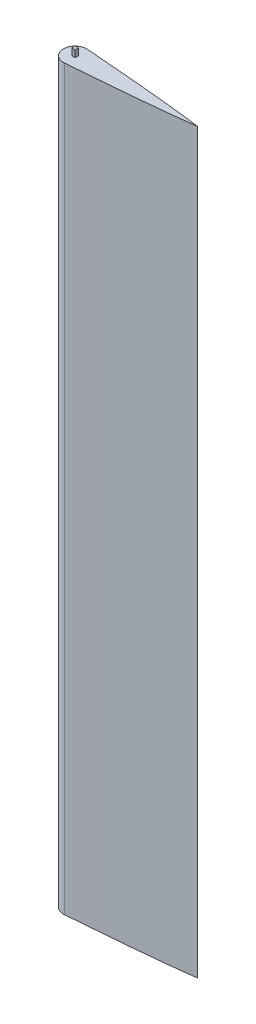
ISO-10303-21;
HEADER;
FILE_DESCRIPTION(('STEP AP214'),'2;1');
FILE_NAME('part.step','',(''),(''),'','','');
FILE_SCHEMA(('AUTOMOTIVE_DESIGN { 1 0 10303 214 1 1 1 1 }'));
ENDSEC;
DATA;
#1=APPLICATION_CONTEXT('core data for automotive mechanical design processes');
#2=APPLICATION_PROTOCOL_DEFINITION('international standard','automotive_design',2000,#1);
#3=PRODUCT_CONTEXT('',#1,'mechanical');
#4=PRODUCT('Part','Part','',(#3));
#5=PRODUCT_RELATED_PRODUCT_CATEGORY('part','',(#4));
#6=PRODUCT_DEFINITION_FORMATION('','',#4);
#7=PRODUCT_DEFINITION_CONTEXT('part definition',#1,'design');
#8=PRODUCT_DEFINITION('design','',#6,#7);
#9=PRODUCT_DEFINITION_SHAPE('','',#8);
#10=(LENGTH_UNIT() NAMED_UNIT(*) SI_UNIT(.MILLI.,.METRE.));
#11=(NAMED_UNIT(*) PLANE_ANGLE_UNIT() SI_UNIT($,.RADIAN.));
#12=(NAMED_UNIT(*) SI_UNIT($,.STERADIAN.) SOLID_ANGLE_UNIT());
#13=UNCERTAINTY_MEASURE_WITH_UNIT(LENGTH_MEASURE(1.E-05),#10,'distance_accuracy_value','');
#14=(GEOMETRIC_REPRESENTATION_CONTEXT(3) GLOBAL_UNCERTAINTY_ASSIGNED_CONTEXT((#13)) GLOBAL_UNIT_ASSIGNED_CONTEXT((#10,
#11,#12)) REPRESENTATION_CONTEXT('',''));
#15=CARTESIAN_POINT('',(0.,0.,0.));
#16=DIRECTION('',(0.,0.,1.));
#17=DIRECTION('',(1.,0.,0.));
#18=AXIS2_PLACEMENT_3D('',#15,#16,#17);
#19=CARTESIAN_POINT('',(1000.,220.,0.));
#20=CARTESIAN_POINT('',(1000.00413613689,220.,-0.0513414966727191));
#21=CARTESIAN_POINT('',(1000.01817994757,220.,-0.225666060429818));
#22=CARTESIAN_POINT('',(1000.16884232111,220.,-0.540340060592524));
#23=CARTESIAN_POINT('',(1000.4745357247,220.,-0.950597665115014));
#24=CARTESIAN_POINT('',(1001.00360978021,220.,-1.44445832491377));
#25=CARTESIAN_POINT('',(1001.88069119015,220.,-2.02908702601063));
#26=CARTESIAN_POINT('',(1003.27369514241,220.,-2.64181194471628));
#27=CARTESIAN_POINT('',(1005.18752958675,220.,-3.2143505546475));
#28=CARTESIAN_POINT('',(1007.49056329049,220.,-3.72188328287637));
#29=CARTESIAN_POINT('',(1009.9978475025,220.,-4.16061643478134));
#30=CARTESIAN_POINT('',(1012.58979683905,220.,-4.5274491318209));
#31=CARTESIAN_POINT('',(1015.22215521288,220.,-4.82640929712996));
#32=CARTESIAN_POINT('',(1017.8798758622,220.,-5.0656463590458));
#33=CARTESIAN_POINT('',(1020.55728748289,220.,-5.25773571248717));
#34=CARTESIAN_POINT('',(1023.24913184173,220.,-5.40664331406146));
#35=CARTESIAN_POINT('',(1025.95111776376,220.,-5.52117781773406));
#36=CARTESIAN_POINT('',(1028.6616767227,220.,-5.60212082629922));
#37=CARTESIAN_POINT('',(1031.37745516181,220.,-5.65541034888753));
#38=CARTESIAN_POINT('',(1034.09779748937,220.,-5.68359849417077));
#39=CARTESIAN_POINT('',(1036.82178898012,220.,-5.68551314895913));
#40=CARTESIAN_POINT('',(1039.54985059279,220.,-5.66680050341008));
#41=CARTESIAN_POINT('',(1043.19336684222,220.,-5.61631334010591));
#42=CARTESIAN_POINT('',(1046.83942417105,220.,-5.53046941537065));
#43=CARTESIAN_POINT('',(1050.4876552261,220.,-5.41471957955391));
#44=CARTESIAN_POINT('',(1053.22648580868,220.,-5.3143162649764));
#45=CARTESIAN_POINT('',(1056.88031871196,220.,-5.16385140479881));
#46=CARTESIAN_POINT('',(1060.53469143182,220.,-4.98973605616077));
#47=CARTESIAN_POINT('',(1064.18949961503,220.,-4.79465845283444));
#48=CARTESIAN_POINT('',(1066.93177674791,220.,-4.63856062331077));
#49=CARTESIAN_POINT('',(1070.58915829291,220.,-4.41830608921612));
#50=CARTESIAN_POINT('',(1074.24643545999,220.,-4.18091191600088));
#51=CARTESIAN_POINT('',(1078.81840685728,220.,-3.86430582644972));
#52=CARTESIAN_POINT('',(1082.47615124474,220.,-3.59601785291006));
#53=CARTESIAN_POINT('',(1086.13339366041,220.,-3.31439385666073));
#54=CARTESIAN_POINT('',(1088.8759632214,220.,-3.09637478585474));
#55=CARTESIAN_POINT('',(1091.61799893897,220.,-2.8714046664782));
#56=CARTESIAN_POINT('',(1094.35968365379,220.,-2.63961817275009));
#57=CARTESIAN_POINT('',(1097.10106065168,220.,-2.40120118659106));
#58=CARTESIAN_POINT('',(1099.84175214664,220.,-2.15631577874861));
#59=CARTESIAN_POINT('',(1102.58081364936,220.,-1.90455090633259));
#60=CARTESIAN_POINT('',(1105.31707001157,220.,-1.64547853591484));
#61=CARTESIAN_POINT('',(1108.04948150949,220.,-1.37722038964263));
#62=CARTESIAN_POINT('',(1110.77648744449,220.,-1.0976386329448));
#63=CARTESIAN_POINT('',(1113.48794761282,220.,-0.807843629365417));
#64=CARTESIAN_POINT('',(1116.12783503238,220.,-0.505124450753502));
#65=CARTESIAN_POINT('',(1118.29491033691,220.,-0.236043522796747));
#66=CARTESIAN_POINT('',(1119.56565292166,220.,-0.060128693936704));
#67=CARTESIAN_POINT('',(1120.,220.,0.));
#68=B_SPLINE_CURVE_WITH_KNOTS('',3,(#19,#20,#21,#22,#23,#24,#25,#26,#27,#28,#29,#30,#31,#32,#33,
#34,#35,#36,#37,#38,#39,#40,#41,#42,#43,#44,#45,#46,#47,#48,#49,#50,#51,#52,#53,#54,#55,#56,#57,
#58,#59,#60,#61,#62,#63,#64,#65,#66,#67),.UNSPECIFIED.,.F.,.F.,(4,1,1,1,1,1,1,1,1,1,1,1,1,1,1,1,
1,1,1,1,1,1,1,1,1,1,1,1,1,1,1,1,1,1,1,1,1,1,1,1,1,1,1,1,1,1,4),(0.,0.00126617665151783,
0.00429916747114532,0.00839844934062874,0.0138887071570412,0.0220514195977793,
0.0343025286004704,0.0512809792222127,0.0712839615209467,0.092471998761859,0.114085613956521,
0.135878251482366,0.15784644888147,0.179935950117866,0.202120581100522,0.224377529096981,
0.246676263269634,0.269042626432452,0.29141201691861,0.313813994985901,0.336267016548707,
0.358738731103596,0.403740067464737,0.426271069557772,0.448818121995205,0.471376668600461,
0.516519940420265,0.539105680915336,0.561701662410306,0.584305866492303,0.62952936536456,
0.652148901694669,0.697407359758077,0.720040805867352,0.742672894666943,0.765304529885395,
0.787938654860651,0.81057607841219,0.833214133227245,0.855845421097598,0.878458096210862,
0.901043957953586,0.92360245187902,0.946110353688878,0.968340531725538,0.989178612795693,1.),.UNSPECIFIED.);
#69=DIRECTION('',(0.,-1.,0.));
#70=VECTOR('',#69,1.);
#71=SURFACE_OF_LINEAR_EXTRUSION('',#68,#70);
#72=CARTESIAN_POINT('',(1000.,0.,0.));
#73=CARTESIAN_POINT('',(1000.00413613689,0.,-0.0513414966727191));
#74=CARTESIAN_POINT('',(1000.01817994757,0.,-0.225666060429818));
#75=CARTESIAN_POINT('',(1000.16884232111,0.,-0.540340060592524));
#76=CARTESIAN_POINT('',(1000.4745357247,0.,-0.950597665115014));
#77=CARTESIAN_POINT('',(1001.00360978021,0.,-1.44445832491377));
#78=CARTESIAN_POINT('',(1001.88069119015,0.,-2.02908702601063));
#79=CARTESIAN_POINT('',(1003.27369514241,0.,-2.64181194471628));
#80=CARTESIAN_POINT('',(1005.18752958675,0.,-3.2143505546475));
#81=CARTESIAN_POINT('',(1007.49056329049,0.,-3.72188328287637));
#82=CARTESIAN_POINT('',(1009.9978475025,0.,-4.16061643478134));
#83=CARTESIAN_POINT('',(1012.58979683905,0.,-4.5274491318209));
#84=CARTESIAN_POINT('',(1015.22215521288,0.,-4.82640929712996));
#85=CARTESIAN_POINT('',(1017.8798758622,0.,-5.0656463590458));
#86=CARTESIAN_POINT('',(1020.55728748289,0.,-5.25773571248717));
#87=CARTESIAN_POINT('',(1023.24913184173,0.,-5.40664331406146));
#88=CARTESIAN_POINT('',(1025.95111776376,0.,-5.52117781773406));
#89=CARTESIAN_POINT('',(1028.6616767227,0.,-5.60212082629922));
#90=CARTESIAN_POINT('',(1031.37745516181,0.,-5.65541034888753));
#91=CARTESIAN_POINT('',(1034.09779748937,0.,-5.68359849417077));
#92=CARTESIAN_POINT('',(1036.82178898012,0.,-5.68551314895913));
#93=CARTESIAN_POINT('',(1039.54985059279,0.,-5.66680050341008));
#94=CARTESIAN_POINT('',(1043.19336684222,0.,-5.61631334010591));
#95=CARTESIAN_POINT('',(1046.83942417105,0.,-5.53046941537065));
#96=CARTESIAN_POINT('',(1050.4876552261,0.,-5.41471957955391));
#97=CARTESIAN_POINT('',(1053.22648580868,0.,-5.3143162649764));
#98=CARTESIAN_POINT('',(1056.88031871196,0.,-5.16385140479881));
#99=CARTESIAN_POINT('',(1060.53469143182,0.,-4.98973605616077));
#100=CARTESIAN_POINT('',(1064.18949961503,0.,-4.79465845283444));
#101=CARTESIAN_POINT('',(1066.93177674791,0.,-4.63856062331077));
#102=CARTESIAN_POINT('',(1070.58915829291,0.,-4.41830608921612));
#103=CARTESIAN_POINT('',(1074.24643545999,0.,-4.18091191600088));
#104=CARTESIAN_POINT('',(1078.81840685728,0.,-3.86430582644972));
#105=CARTESIAN_POINT('',(1082.47615124474,0.,-3.59601785291006));
#106=CARTESIAN_POINT('',(1086.13339366041,0.,-3.31439385666073));
#107=CARTESIAN_POINT('',(1088.8759632214,0.,-3.09637478585474));
#108=CARTESIAN_POINT('',(1091.61799893897,0.,-2.8714046664782));
#109=CARTESIAN_POINT('',(1094.35968365379,0.,-2.63961817275009));
#110=CARTESIAN_POINT('',(1097.10106065168,0.,-2.40120118659106));
#111=CARTESIAN_POINT('',(1099.84175214664,0.,-2.15631577874861));
#112=CARTESIAN_POINT('',(1102.58081364936,0.,-1.90455090633259));
#113=CARTESIAN_POINT('',(1105.31707001157,0.,-1.64547853591484));
#114=CARTESIAN_POINT('',(1108.04948150949,0.,-1.37722038964263));
#115=CARTESIAN_POINT('',(1110.77648744449,0.,-1.0976386329448));
#116=CARTESIAN_POINT('',(1113.48794761282,0.,-0.807843629365417));
#117=CARTESIAN_POINT('',(1116.12783503238,0.,-0.505124450753502));
#118=CARTESIAN_POINT('',(1118.29491033691,0.,-0.236043522796747));
#119=CARTESIAN_POINT('',(1119.56565292166,0.,-0.060128693936704));
#120=CARTESIAN_POINT('',(1120.,0.,0.));
#121=B_SPLINE_CURVE_WITH_KNOTS('',3,(#72,#73,#74,#75,#76,#77,#78,#79,#80,#81,#82,#83,#84,#85,
#86,#87,#88,#89,#90,#91,#92,#93,#94,#95,#96,#97,#98,#99,#100,#101,#102,#103,#104,#105,#106,#107,
#108,#109,#110,#111,#112,#113,#114,#115,#116,#117,#118,#119,#120),.UNSPECIFIED.,.F.,.F.,(4,1,1,
1,1,1,1,1,1,1,1,1,1,1,1,1,1,1,1,1,1,1,1,1,1,1,1,1,1,1,1,1,1,1,1,1,1,1,1,1,1,1,1,1,1,1,4),(0.,
0.00126617665151783,0.00429916747114532,0.00839844934062874,0.0138887071570412,
0.0220514195977793,0.0343025286004704,0.0512809792222127,0.0712839615209467,0.092471998761859,
0.114085613956521,0.135878251482366,0.15784644888147,0.179935950117866,0.202120581100522,
0.224377529096981,0.246676263269634,0.269042626432452,0.29141201691861,0.313813994985901,
0.336267016548707,0.358738731103596,0.403740067464737,0.426271069557772,0.448818121995205,
0.471376668600461,0.516519940420265,0.539105680915336,0.561701662410306,0.584305866492303,
0.62952936536456,0.652148901694669,0.697407359758077,0.720040805867352,0.742672894666943,
0.765304529885395,0.787938654860651,0.81057607841219,0.833214133227245,0.855845421097598,
0.878458096210862,0.901043957953586,0.92360245187902,0.946110353688878,0.968340531725538,
0.989178612795693,1.),.UNSPECIFIED.);
#122=CARTESIAN_POINT('',(1083.7717477888,0.,-3.49553665701031));
#123=VERTEX_POINT('',#122);
#124=CARTESIAN_POINT('',(1120.,0.,0.));
#125=VERTEX_POINT('',#124);
#126=EDGE_CURVE('E151',#123,#125,#121,.T.);
#127=ORIENTED_EDGE('',*,*,#126,.F.);
#128=DIRECTION('',(0.,-1.,0.));
#129=VECTOR('',#128,1.);
#130=CARTESIAN_POINT('',(1083.7717477888,220.,-3.49553665701031));
#131=LINE('',#130,#129);
#132=CARTESIAN_POINT('',(1083.7717477888,220.,-3.49553665701031));
#133=VERTEX_POINT('',#132);
#134=EDGE_CURVE('E11',#133,#123,#131,.T.);
#135=ORIENTED_EDGE('',*,*,#134,.F.);
#136=CARTESIAN_POINT('',(1120.,220.,0.));
#137=VERTEX_POINT('',#136);
#138=EDGE_CURVE('E159',#133,#137,#68,.T.);
#139=ORIENTED_EDGE('',*,*,#138,.T.);
#140=DIRECTION('',(0.,-1.,0.));
#141=VECTOR('',#140,1.);
#142=CARTESIAN_POINT('',(1120.,220.,0.));
#143=LINE('',#142,#141);
#144=EDGE_CURVE('E215',#137,#125,#143,.T.);
#145=ORIENTED_EDGE('',*,*,#144,.T.);
#146=EDGE_LOOP('',(#127,#135,#139,#145));
#147=FACE_BOUND('',#146,.T.);
#148=ADVANCED_FACE('F37',(#147),#71,.T.);
#149=CARTESIAN_POINT('',(1083.50565040565,220.,6.13392382947751E-08));
#150=DIRECTION('',(0.,-1.,0.));
#151=DIRECTION('',(0.,0.,-1.));
#152=AXIS2_PLACEMENT_3D('',#149,#150,#151);
#153=CYLINDRICAL_SURFACE('',#152,3.50565040565225);
#154=CARTESIAN_POINT('',(1083.50565040565,0.,6.13392382947751E-08));
#155=DIRECTION('',(0.,1.,0.));
#156=DIRECTION('',(0.,0.,1.));
#157=AXIS2_PLACEMENT_3D('',#154,#155,#156);
#158=CIRCLE('',#157,3.50565040565225);
#159=CARTESIAN_POINT('',(1083.7717441902,0.,3.49553705362999));
#160=VERTEX_POINT('',#159);
#161=EDGE_CURVE('E155',#123,#160,#158,.T.);
#162=ORIENTED_EDGE('',*,*,#161,.T.);
#163=DIRECTION('',(0.,-1.,0.));
#164=VECTOR('',#163,1.);
#165=CARTESIAN_POINT('',(1083.7717441902,220.,3.49553705362999));
#166=LINE('',#165,#164);
#167=CARTESIAN_POINT('',(1083.7717441902,220.,3.49553705362999));
#168=VERTEX_POINT('',#167);
#169=EDGE_CURVE('E46',#168,#160,#166,.T.);
#170=ORIENTED_EDGE('',*,*,#169,.F.);
#171=CARTESIAN_POINT('',(1083.50565040565,220.,6.13392382947751E-08));
#172=DIRECTION('',(0.,1.,0.));
#173=DIRECTION('',(0.,0.,1.));
#174=AXIS2_PLACEMENT_3D('',#171,#172,#173);
#175=CIRCLE('',#174,3.50565040565225);
#176=EDGE_CURVE('E164',#133,#168,#175,.T.);
#177=ORIENTED_EDGE('',*,*,#176,.F.);
#178=ORIENTED_EDGE('',*,*,#134,.T.);
#179=EDGE_LOOP('',(#162,#170,#177,#178));
#180=FACE_BOUND('',#179,.T.);
#181=ADVANCED_FACE('F186',(#180),#153,.T.);
#182=CARTESIAN_POINT('',(1120.,220.,0.));
#183=CARTESIAN_POINT('',(1119.56565292166,220.,0.060128693936704));
#184=CARTESIAN_POINT('',(1118.29491033691,220.,0.236043522796747));
#185=CARTESIAN_POINT('',(1116.12783503238,220.,0.505124450753503));
#186=CARTESIAN_POINT('',(1113.48794761283,220.,0.807843629365417));
#187=CARTESIAN_POINT('',(1110.77648744449,220.,1.0976386329448));
#188=CARTESIAN_POINT('',(1108.04948150949,220.,1.37722038964263));
#189=CARTESIAN_POINT('',(1105.31707001157,220.,1.64547853591484));
#190=CARTESIAN_POINT('',(1102.58081364936,220.,1.90455090633259));
#191=CARTESIAN_POINT('',(1099.84175214664,220.,2.15631577874861));
#192=CARTESIAN_POINT('',(1097.10106065169,220.,2.40120118659106));
#193=CARTESIAN_POINT('',(1094.35968365379,220.,2.63961817275009));
#194=CARTESIAN_POINT('',(1091.61799893897,220.,2.8714046664782));
#195=CARTESIAN_POINT('',(1087.96191780518,220.,3.17136757500199));
#196=CARTESIAN_POINT('',(1083.3907575757,220.,3.52893034218228));
#197=CARTESIAN_POINT('',(1078.81840685728,220.,3.86430582644971));
#198=CARTESIAN_POINT('',(1074.24643545999,220.,4.18091191600089));
#199=CARTESIAN_POINT('',(1070.58915829291,220.,4.41830608921612));
#200=CARTESIAN_POINT('',(1066.93177674791,220.,4.63856062331077));
#201=CARTESIAN_POINT('',(1064.18949961503,220.,4.79465845283444));
#202=CARTESIAN_POINT('',(1060.53469143182,220.,4.98973605616077));
#203=CARTESIAN_POINT('',(1056.88031871196,220.,5.16385140479881));
#204=CARTESIAN_POINT('',(1053.22648580868,220.,5.3143162649764));
#205=CARTESIAN_POINT('',(1050.4876552261,220.,5.41471957955391));
#206=CARTESIAN_POINT('',(1046.83942417105,220.,5.53046941537065));
#207=CARTESIAN_POINT('',(1043.19336684222,220.,5.61631334010591));
#208=CARTESIAN_POINT('',(1039.54985059279,220.,5.66680050341008));
#209=CARTESIAN_POINT('',(1036.82178898012,220.,5.68551314895913));
#210=CARTESIAN_POINT('',(1034.09779748937,220.,5.68359849417077));
#211=CARTESIAN_POINT('',(1031.37745516181,220.,5.65541034888753));
#212=CARTESIAN_POINT('',(1028.6616767227,220.,5.60212082629922));
#213=CARTESIAN_POINT('',(1025.95111776376,220.,5.52117781773406));
#214=CARTESIAN_POINT('',(1023.24913184173,220.,5.40664331406146));
#215=CARTESIAN_POINT('',(1020.55728748289,220.,5.25773571248717));
#216=CARTESIAN_POINT('',(1017.8798758622,220.,5.0656463590458));
#217=CARTESIAN_POINT('',(1015.22215521288,220.,4.82640929712996));
#218=CARTESIAN_POINT('',(1012.58979683905,220.,4.5274491318209));
#219=CARTESIAN_POINT('',(1009.9978475025,220.,4.16061643478134));
#220=CARTESIAN_POINT('',(1007.49056329049,220.,3.72188328287637));
#221=CARTESIAN_POINT('',(1005.18752958675,220.,3.2143505546475));
#222=CARTESIAN_POINT('',(1003.27369514241,220.,2.64181194471628));
#223=CARTESIAN_POINT('',(1001.88069119015,220.,2.02908702601063));
#224=CARTESIAN_POINT('',(1001.00360978021,220.,1.44445832491377));
#225=CARTESIAN_POINT('',(1000.4745357247,220.,0.950597665115007));
#226=CARTESIAN_POINT('',(1000.16884232111,220.,0.540340060592529));
#227=CARTESIAN_POINT('',(1000.01817994757,220.,0.225666060429815));
#228=CARTESIAN_POINT('',(1000.00413613689,220.,0.051341496672719));
#229=CARTESIAN_POINT('',(1000.,220.,0.));
#230=B_SPLINE_CURVE_WITH_KNOTS('',3,(#182,#183,#184,#185,#186,#187,#188,#189,#190,#191,#192,
#193,#194,#195,#196,#197,#198,#199,#200,#201,#202,#203,#204,#205,#206,#207,#208,#209,#210,#211,
#212,#213,#214,#215,#216,#217,#218,#219,#220,#221,#222,#223,#224,#225,#226,#227,#228,#229),
.UNSPECIFIED.,.F.,.F.,(4,1,1,1,1,1,1,1,1,1,1,1,1,1,1,1,1,1,1,1,1,1,1,1,1,1,1,1,1,1,1,1,1,1,1,1,
1,1,1,1,1,1,1,1,1,4),(0.,0.010821387204307,0.0316594682744622,0.0538896463111219,
0.0763975481209804,0.0989560420464143,0.121541903789138,0.144154578902402,0.166785866772755,
0.18942392158781,0.212061345139349,0.234695470114605,0.257327105333057,0.302592640241923,
0.347851098305331,0.37047063463544,0.415694133507697,0.438298337589694,0.460894319084664,
0.483480059579735,0.528623331399539,0.551181878004795,0.573728930442228,0.596259932535263,
0.641261268896404,0.663732983451293,0.686186005014099,0.70858798308139,0.730957373567548,
0.753323736730366,0.775622470903019,0.797879418899478,0.820064049882134,0.84215355111853,
0.864121748517634,0.885914386043479,0.907528001238141,0.928716038479053,0.948719020777787,
0.96569747139953,0.977948580402221,0.986111292842959,0.991601550659371,0.995700832528855,
0.998733823348482,1.),.UNSPECIFIED.);
#231=DIRECTION('',(0.,-1.,0.));
#232=VECTOR('',#231,1.);
#233=SURFACE_OF_LINEAR_EXTRUSION('',#230,#232);
#234=CARTESIAN_POINT('',(1120.,0.,0.));
#235=CARTESIAN_POINT('',(1119.56565292166,0.,0.060128693936704));
#236=CARTESIAN_POINT('',(1118.29491033691,0.,0.236043522796747));
#237=CARTESIAN_POINT('',(1116.12783503238,0.,0.505124450753503));
#238=CARTESIAN_POINT('',(1113.48794761283,0.,0.807843629365417));
#239=CARTESIAN_POINT('',(1110.77648744449,0.,1.0976386329448));
#240=CARTESIAN_POINT('',(1108.04948150949,0.,1.37722038964263));
#241=CARTESIAN_POINT('',(1105.31707001157,0.,1.64547853591484));
#242=CARTESIAN_POINT('',(1102.58081364936,0.,1.90455090633259));
#243=CARTESIAN_POINT('',(1099.84175214664,0.,2.15631577874861));
#244=CARTESIAN_POINT('',(1097.10106065169,0.,2.40120118659106));
#245=CARTESIAN_POINT('',(1094.35968365379,0.,2.63961817275009));
#246=CARTESIAN_POINT('',(1091.61799893897,0.,2.8714046664782));
#247=CARTESIAN_POINT('',(1087.96191780518,0.,3.17136757500199));
#248=CARTESIAN_POINT('',(1083.3907575757,0.,3.52893034218228));
#249=CARTESIAN_POINT('',(1078.81840685728,0.,3.86430582644971));
#250=CARTESIAN_POINT('',(1074.24643545999,0.,4.18091191600089));
#251=CARTESIAN_POINT('',(1070.58915829291,0.,4.41830608921612));
#252=CARTESIAN_POINT('',(1066.93177674791,0.,4.63856062331077));
#253=CARTESIAN_POINT('',(1064.18949961503,0.,4.79465845283444));
#254=CARTESIAN_POINT('',(1060.53469143182,0.,4.98973605616077));
#255=CARTESIAN_POINT('',(1056.88031871196,0.,5.16385140479881));
#256=CARTESIAN_POINT('',(1053.22648580868,0.,5.3143162649764));
#257=CARTESIAN_POINT('',(1050.4876552261,0.,5.41471957955391));
#258=CARTESIAN_POINT('',(1046.83942417105,0.,5.53046941537065));
#259=CARTESIAN_POINT('',(1043.19336684222,0.,5.61631334010591));
#260=CARTESIAN_POINT('',(1039.54985059279,0.,5.66680050341008));
#261=CARTESIAN_POINT('',(1036.82178898012,0.,5.68551314895913));
#262=CARTESIAN_POINT('',(1034.09779748937,0.,5.68359849417077));
#263=CARTESIAN_POINT('',(1031.37745516181,0.,5.65541034888753));
#264=CARTESIAN_POINT('',(1028.6616767227,0.,5.60212082629922));
#265=CARTESIAN_POINT('',(1025.95111776376,0.,5.52117781773406));
#266=CARTESIAN_POINT('',(1023.24913184173,0.,5.40664331406146));
#267=CARTESIAN_POINT('',(1020.55728748289,0.,5.25773571248717));
#268=CARTESIAN_POINT('',(1017.8798758622,0.,5.0656463590458));
#269=CARTESIAN_POINT('',(1015.22215521288,0.,4.82640929712996));
#270=CARTESIAN_POINT('',(1012.58979683905,0.,4.5274491318209));
#271=CARTESIAN_POINT('',(1009.9978475025,0.,4.16061643478134));
#272=CARTESIAN_POINT('',(1007.49056329049,0.,3.72188328287637));
#273=CARTESIAN_POINT('',(1005.18752958675,0.,3.2143505546475));
#274=CARTESIAN_POINT('',(1003.27369514241,0.,2.64181194471628));
#275=CARTESIAN_POINT('',(1001.88069119015,0.,2.02908702601063));
#276=CARTESIAN_POINT('',(1001.00360978021,0.,1.44445832491377));
#277=CARTESIAN_POINT('',(1000.4745357247,0.,0.950597665115007));
#278=CARTESIAN_POINT('',(1000.16884232111,0.,0.540340060592529));
#279=CARTESIAN_POINT('',(1000.01817994757,0.,0.225666060429815));
#280=CARTESIAN_POINT('',(1000.00413613689,0.,0.051341496672719));
#281=CARTESIAN_POINT('',(1000.,0.,0.));
#282=B_SPLINE_CURVE_WITH_KNOTS('',3,(#234,#235,#236,#237,#238,#239,#240,#241,#242,#243,#244,
#245,#246,#247,#248,#249,#250,#251,#252,#253,#254,#255,#256,#257,#258,#259,#260,#261,#262,#263,
#264,#265,#266,#267,#268,#269,#270,#271,#272,#273,#274,#275,#276,#277,#278,#279,#280,#281),
.UNSPECIFIED.,.F.,.F.,(4,1,1,1,1,1,1,1,1,1,1,1,1,1,1,1,1,1,1,1,1,1,1,1,1,1,1,1,1,1,1,1,1,1,1,1,
1,1,1,1,1,1,1,1,1,4),(0.,0.010821387204307,0.0316594682744622,0.0538896463111219,
0.0763975481209804,0.0989560420464143,0.121541903789138,0.144154578902402,0.166785866772755,
0.18942392158781,0.212061345139349,0.234695470114605,0.257327105333057,0.302592640241923,
0.347851098305331,0.37047063463544,0.415694133507697,0.438298337589694,0.460894319084664,
0.483480059579735,0.528623331399539,0.551181878004795,0.573728930442228,0.596259932535263,
0.641261268896404,0.663732983451293,0.686186005014099,0.70858798308139,0.730957373567548,
0.753323736730366,0.775622470903019,0.797879418899478,0.820064049882134,0.84215355111853,
0.864121748517634,0.885914386043479,0.907528001238141,0.928716038479053,0.948719020777787,
0.96569747139953,0.977948580402221,0.986111292842959,0.991601550659371,0.995700832528855,
0.998733823348482,1.),.UNSPECIFIED.);
#283=EDGE_CURVE('E200',#125,#160,#282,.T.);
#284=ORIENTED_EDGE('',*,*,#283,.F.);
#285=ORIENTED_EDGE('',*,*,#144,.F.);
#286=EDGE_CURVE('E170',#137,#168,#230,.T.);
#287=ORIENTED_EDGE('',*,*,#286,.T.);
#288=ORIENTED_EDGE('',*,*,#169,.T.);
#289=EDGE_LOOP('',(#284,#285,#287,#288));
#290=FACE_BOUND('',#289,.T.);
#291=ADVANCED_FACE('F182',(#290),#233,.T.);
#292=CARTESIAN_POINT('',(0.,220.,0.));
#293=DIRECTION('',(0.,1.,0.));
#294=DIRECTION('',(0.,0.,1.));
#295=AXIS2_PLACEMENT_3D('',#292,#293,#294);
#296=PLANE('',#295);
#297=ORIENTED_EDGE('',*,*,#138,.F.);
#298=ORIENTED_EDGE('',*,*,#176,.T.);
#299=ORIENTED_EDGE('',*,*,#286,.F.);
#300=EDGE_LOOP('',(#297,#298,#299));
#301=FACE_BOUND('',#300,.T.);
#302=DIRECTION('',(0.,0.,-1.));
#303=VECTOR('',#302,1.);
#304=CARTESIAN_POINT('',(1084.00565040565,220.,0.));
#305=LINE('',#304,#303);
#306=CARTESIAN_POINT('',(1084.00565040565,220.,0.500000061339246));
#307=VERTEX_POINT('',#306);
#308=CARTESIAN_POINT('',(1084.00565040565,220.,-0.499999938660754));
#309=VERTEX_POINT('',#308);
#310=EDGE_CURVE('E176',#307,#309,#305,.T.);
#311=ORIENTED_EDGE('',*,*,#310,.F.);
#312=DIRECTION('',(1.,0.,0.));
#313=VECTOR('',#312,1.);
#314=CARTESIAN_POINT('',(0.,220.,0.500000061339246));
#315=LINE('',#314,#313);
#316=CARTESIAN_POINT('',(1083.00565040565,220.,0.500000061339246));
#317=VERTEX_POINT('',#316);
#318=EDGE_CURVE('E150',#317,#307,#315,.T.);
#319=ORIENTED_EDGE('',*,*,#318,.F.);
#320=DIRECTION('',(0.,0.,-1.));
#321=VECTOR('',#320,1.);
#322=CARTESIAN_POINT('',(1083.00565040565,220.,0.));
#323=LINE('',#322,#321);
#324=CARTESIAN_POINT('',(1083.00565040565,220.,-0.499999938660754));
#325=VERTEX_POINT('',#324);
#326=EDGE_CURVE('E224',#317,#325,#323,.T.);
#327=ORIENTED_EDGE('',*,*,#326,.T.);
#328=DIRECTION('',(1.,0.,0.));
#329=VECTOR('',#328,1.);
#330=CARTESIAN_POINT('',(0.,220.,-0.499999938660754));
#331=LINE('',#330,#329);
#332=EDGE_CURVE('E216',#325,#309,#331,.T.);
#333=ORIENTED_EDGE('',*,*,#332,.T.);
#334=EDGE_LOOP('',(#311,#319,#327,#333));
#335=FACE_BOUND('',#334,.T.);
#336=ADVANCED_FACE('F185',(#301,#335),#296,.T.);
#337=CARTESIAN_POINT('',(0.,0.,0.));
#338=DIRECTION('',(0.,1.,0.));
#339=DIRECTION('',(0.,0.,1.));
#340=AXIS2_PLACEMENT_3D('',#337,#338,#339);
#341=PLANE('',#340);
#342=ORIENTED_EDGE('',*,*,#126,.T.);
#343=ORIENTED_EDGE('',*,*,#283,.T.);
#344=ORIENTED_EDGE('',*,*,#161,.F.);
#345=EDGE_LOOP('',(#342,#343,#344));
#346=FACE_BOUND('',#345,.T.);
#347=DIRECTION('',(0.,0.,-1.));
#348=VECTOR('',#347,1.);
#349=CARTESIAN_POINT('',(1084.00565040565,0.,0.));
#350=LINE('',#349,#348);
#351=CARTESIAN_POINT('',(1084.00565040565,0.,0.500000061339246));
#352=VERTEX_POINT('',#351);
#353=CARTESIAN_POINT('',(1084.00565040565,0.,-0.499999938660754));
#354=VERTEX_POINT('',#353);
#355=EDGE_CURVE('E82',#352,#354,#350,.T.);
#356=ORIENTED_EDGE('',*,*,#355,.T.);
#357=DIRECTION('',(1.,0.,0.));
#358=VECTOR('',#357,1.);
#359=CARTESIAN_POINT('',(0.,0.,-0.499999938660754));
#360=LINE('',#359,#358);
#361=CARTESIAN_POINT('',(1083.00565040565,0.,-0.499999938660754));
#362=VERTEX_POINT('',#361);
#363=EDGE_CURVE('E165',#362,#354,#360,.T.);
#364=ORIENTED_EDGE('',*,*,#363,.F.);
#365=DIRECTION('',(0.,0.,-1.));
#366=VECTOR('',#365,1.);
#367=CARTESIAN_POINT('',(1083.00565040565,0.,0.));
#368=LINE('',#367,#366);
#369=CARTESIAN_POINT('',(1083.00565040565,0.,0.500000061339246));
#370=VERTEX_POINT('',#369);
#371=EDGE_CURVE('E77',#370,#362,#368,.T.);
#372=ORIENTED_EDGE('',*,*,#371,.F.);
#373=DIRECTION('',(1.,0.,0.));
#374=VECTOR('',#373,1.);
#375=CARTESIAN_POINT('',(0.,0.,0.500000061339246));
#376=LINE('',#375,#374);
#377=EDGE_CURVE('E204',#370,#352,#376,.T.);
#378=ORIENTED_EDGE('',*,*,#377,.T.);
#379=EDGE_LOOP('',(#356,#364,#372,#378));
#380=FACE_BOUND('',#379,.T.);
#381=ADVANCED_FACE('F188',(#346,#380),#341,.F.);
#382=CARTESIAN_POINT('',(0.,-2.,0.));
#383=DIRECTION('',(0.,1.,0.));
#384=DIRECTION('',(0.,0.,1.));
#385=AXIS2_PLACEMENT_3D('',#382,#383,#384);
#386=PLANE('',#385);
#387=DIRECTION('',(1.,0.,0.));
#388=VECTOR('',#387,1.);
#389=CARTESIAN_POINT('',(0.,-2.,0.500000061339246));
#390=LINE('',#389,#388);
#391=CARTESIAN_POINT('',(1083.00565040565,-2.,0.500000061339246));
#392=VERTEX_POINT('',#391);
#393=CARTESIAN_POINT('',(1084.00565040565,-2.,0.500000061339246));
#394=VERTEX_POINT('',#393);
#395=EDGE_CURVE('E249',#392,#394,#390,.T.);
#396=ORIENTED_EDGE('',*,*,#395,.F.);
#397=DIRECTION('',(0.,0.,-1.));
#398=VECTOR('',#397,1.);
#399=CARTESIAN_POINT('',(1083.00565040565,-2.,0.));
#400=LINE('',#399,#398);
#401=CARTESIAN_POINT('',(1083.00565040565,-2.,-0.499999938660754));
#402=VERTEX_POINT('',#401);
#403=EDGE_CURVE('E146',#392,#402,#400,.T.);
#404=ORIENTED_EDGE('',*,*,#403,.T.);
#405=DIRECTION('',(1.,0.,0.));
#406=VECTOR('',#405,1.);
#407=CARTESIAN_POINT('',(0.,-2.,-0.499999938660754));
#408=LINE('',#407,#406);
#409=CARTESIAN_POINT('',(1084.00565040565,-2.,-0.499999938660754));
#410=VERTEX_POINT('',#409);
#411=EDGE_CURVE('E253',#402,#410,#408,.T.);
#412=ORIENTED_EDGE('',*,*,#411,.T.);
#413=DIRECTION('',(0.,0.,-1.));
#414=VECTOR('',#413,1.);
#415=CARTESIAN_POINT('',(1084.00565040565,-2.,0.));
#416=LINE('',#415,#414);
#417=EDGE_CURVE('E252',#394,#410,#416,.T.);
#418=ORIENTED_EDGE('',*,*,#417,.F.);
#419=EDGE_LOOP('',(#396,#404,#412,#418));
#420=FACE_BOUND('',#419,.T.);
#421=ADVANCED_FACE('F260',(#420),#386,.F.);
#422=CARTESIAN_POINT('',(1083.00565040565,222.,0.));
#423=DIRECTION('',(-1.,0.,0.));
#424=DIRECTION('',(0.,0.,1.));
#425=AXIS2_PLACEMENT_3D('',#422,#423,#424);
#426=PLANE('',#425);
#427=ORIENTED_EDGE('',*,*,#371,.T.);
#428=DIRECTION('',(0.,-1.,0.));
#429=VECTOR('',#428,1.);
#430=CARTESIAN_POINT('',(1083.00565040565,222.,-0.499999938660754));
#431=LINE('',#430,#429);
#432=EDGE_CURVE('E234',#362,#402,#431,.T.);
#433=ORIENTED_EDGE('',*,*,#432,.T.);
#434=ORIENTED_EDGE('',*,*,#403,.F.);
#435=DIRECTION('',(0.,-1.,0.));
#436=VECTOR('',#435,1.);
#437=CARTESIAN_POINT('',(1083.00565040565,222.,0.500000061339246));
#438=LINE('',#437,#436);
#439=EDGE_CURVE('E235',#370,#392,#438,.T.);
#440=ORIENTED_EDGE('',*,*,#439,.F.);
#441=EDGE_LOOP('',(#427,#433,#434,#440));
#442=FACE_BOUND('',#441,.T.);
#443=ADVANCED_FACE('F263',(#442),#426,.T.);
#444=CARTESIAN_POINT('',(0.,222.,-0.499999938660754));
#445=DIRECTION('',(0.,0.,-1.));
#446=DIRECTION('',(-1.,0.,0.));
#447=AXIS2_PLACEMENT_3D('',#444,#445,#446);
#448=PLANE('',#447);
#449=ORIENTED_EDGE('',*,*,#363,.T.);
#450=DIRECTION('',(0.,-1.,0.));
#451=VECTOR('',#450,1.);
#452=CARTESIAN_POINT('',(1084.00565040565,222.,-0.499999938660754));
#453=LINE('',#452,#451);
#454=EDGE_CURVE('E239',#354,#410,#453,.T.);
#455=ORIENTED_EDGE('',*,*,#454,.T.);
#456=ORIENTED_EDGE('',*,*,#411,.F.);
#457=ORIENTED_EDGE('',*,*,#432,.F.);
#458=EDGE_LOOP('',(#449,#455,#456,#457));
#459=FACE_BOUND('',#458,.T.);
#460=ADVANCED_FACE('F265',(#459),#448,.T.);
#461=CARTESIAN_POINT('',(1084.00565040565,222.,0.));
#462=DIRECTION('',(-1.,0.,0.));
#463=DIRECTION('',(0.,0.,1.));
#464=AXIS2_PLACEMENT_3D('',#461,#462,#463);
#465=PLANE('',#464);
#466=ORIENTED_EDGE('',*,*,#454,.F.);
#467=ORIENTED_EDGE('',*,*,#355,.F.);
#468=DIRECTION('',(0.,-1.,0.));
#469=VECTOR('',#468,1.);
#470=CARTESIAN_POINT('',(1084.00565040565,222.,0.500000061339246));
#471=LINE('',#470,#469);
#472=EDGE_CURVE('E152',#352,#394,#471,.T.);
#473=ORIENTED_EDGE('',*,*,#472,.T.);
#474=ORIENTED_EDGE('',*,*,#417,.T.);
#475=EDGE_LOOP('',(#466,#467,#473,#474));
#476=FACE_BOUND('',#475,.T.);
#477=ADVANCED_FACE('F267',(#476),#465,.F.);
#478=CARTESIAN_POINT('',(0.,222.,0.500000061339246));
#479=DIRECTION('',(0.,0.,-1.));
#480=DIRECTION('',(-1.,0.,0.));
#481=AXIS2_PLACEMENT_3D('',#478,#479,#480);
#482=PLANE('',#481);
#483=ORIENTED_EDGE('',*,*,#472,.F.);
#484=ORIENTED_EDGE('',*,*,#377,.F.);
#485=ORIENTED_EDGE('',*,*,#439,.T.);
#486=ORIENTED_EDGE('',*,*,#395,.T.);
#487=EDGE_LOOP('',(#483,#484,#485,#486));
#488=FACE_BOUND('',#487,.T.);
#489=ADVANCED_FACE('F273',(#488),#482,.F.);
#490=ORIENTED_EDGE('',*,*,#318,.T.);
#491=CARTESIAN_POINT('',(1084.00565040565,222.,0.500000061339246));
#492=VERTEX_POINT('',#491);
#493=EDGE_CURVE('E130',#492,#307,#471,.T.);
#494=ORIENTED_EDGE('',*,*,#493,.F.);
#495=DIRECTION('',(1.,0.,0.));
#496=VECTOR('',#495,1.);
#497=CARTESIAN_POINT('',(0.,222.,0.500000061339246));
#498=LINE('',#497,#496);
#499=CARTESIAN_POINT('',(1083.00565040565,222.,0.500000061339246));
#500=VERTEX_POINT('',#499);
#501=EDGE_CURVE('E138',#500,#492,#498,.T.);
#502=ORIENTED_EDGE('',*,*,#501,.F.);
#503=EDGE_CURVE('E233',#500,#317,#438,.T.);
#504=ORIENTED_EDGE('',*,*,#503,.T.);
#505=EDGE_LOOP('',(#490,#494,#502,#504));
#506=FACE_BOUND('',#505,.T.);
#507=ADVANCED_FACE('F148',(#506),#482,.F.);
#508=ORIENTED_EDGE('',*,*,#310,.T.);
#509=CARTESIAN_POINT('',(1084.00565040565,222.,-0.499999938660754));
#510=VERTEX_POINT('',#509);
#511=EDGE_CURVE('E133',#510,#309,#453,.T.);
#512=ORIENTED_EDGE('',*,*,#511,.F.);
#513=DIRECTION('',(0.,0.,-1.));
#514=VECTOR('',#513,1.);
#515=CARTESIAN_POINT('',(1084.00565040565,222.,0.));
#516=LINE('',#515,#514);
#517=EDGE_CURVE('E126',#492,#510,#516,.T.);
#518=ORIENTED_EDGE('',*,*,#517,.F.);
#519=ORIENTED_EDGE('',*,*,#493,.T.);
#520=EDGE_LOOP('',(#508,#512,#518,#519));
#521=FACE_BOUND('',#520,.T.);
#522=ADVANCED_FACE('F128',(#521),#465,.F.);
#523=ORIENTED_EDGE('',*,*,#511,.T.);
#524=ORIENTED_EDGE('',*,*,#332,.F.);
#525=CARTESIAN_POINT('',(1083.00565040565,222.,-0.499999938660754));
#526=VERTEX_POINT('',#525);
#527=EDGE_CURVE('E54',#526,#325,#431,.T.);
#528=ORIENTED_EDGE('',*,*,#527,.F.);
#529=DIRECTION('',(1.,0.,0.));
#530=VECTOR('',#529,1.);
#531=CARTESIAN_POINT('',(0.,222.,-0.499999938660754));
#532=LINE('',#531,#530);
#533=EDGE_CURVE('E137',#526,#510,#532,.T.);
#534=ORIENTED_EDGE('',*,*,#533,.T.);
#535=EDGE_LOOP('',(#523,#524,#528,#534));
#536=FACE_BOUND('',#535,.T.);
#537=ADVANCED_FACE('F245',(#536),#448,.T.);
#538=ORIENTED_EDGE('',*,*,#527,.T.);
#539=ORIENTED_EDGE('',*,*,#326,.F.);
#540=ORIENTED_EDGE('',*,*,#503,.F.);
#541=DIRECTION('',(0.,0.,-1.));
#542=VECTOR('',#541,1.);
#543=CARTESIAN_POINT('',(1083.00565040565,222.,0.));
#544=LINE('',#543,#542);
#545=EDGE_CURVE('E143',#500,#526,#544,.T.);
#546=ORIENTED_EDGE('',*,*,#545,.T.);
#547=EDGE_LOOP('',(#538,#539,#540,#546));
#548=FACE_BOUND('',#547,.T.);
#549=ADVANCED_FACE('F232',(#548),#426,.T.);
#550=CARTESIAN_POINT('',(0.,222.,0.));
#551=DIRECTION('',(0.,1.,0.));
#552=DIRECTION('',(0.,0.,1.));
#553=AXIS2_PLACEMENT_3D('',#550,#551,#552);
#554=PLANE('',#553);
#555=ORIENTED_EDGE('',*,*,#501,.T.);
#556=ORIENTED_EDGE('',*,*,#517,.T.);
#557=ORIENTED_EDGE('',*,*,#533,.F.);
#558=ORIENTED_EDGE('',*,*,#545,.F.);
#559=EDGE_LOOP('',(#555,#556,#557,#558));
#560=FACE_BOUND('',#559,.T.);
#561=ADVANCED_FACE('F142',(#560),#554,.T.);
#562=CLOSED_SHELL('',(#148,#181,#291,#336,#381,#421,#443,#460,#477,#489,#507,#522,#537,#549,#561));
#563=MANIFOLD_SOLID_BREP('B2',#562);
#564=ADVANCED_BREP_SHAPE_REPRESENTATION('',(#18,#563),#14);
#565=SHAPE_DEFINITION_REPRESENTATION(#9,#564);
ENDSEC;
END-ISO-10303-21;
